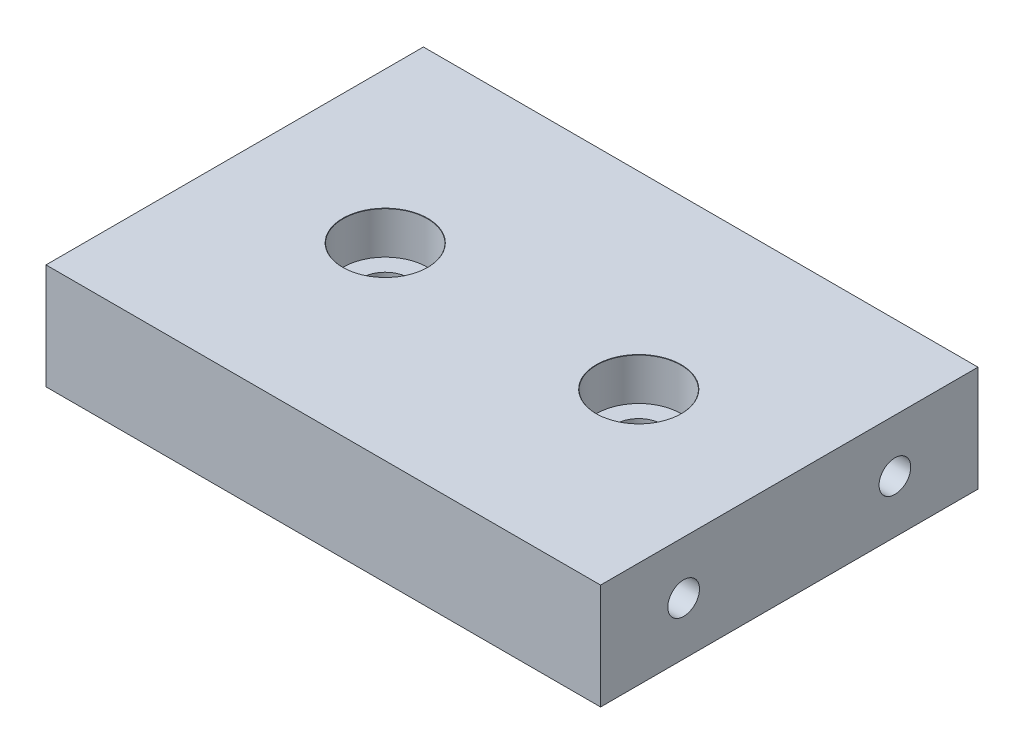
ISO-10303-21;
HEADER;
FILE_DESCRIPTION(('STEP AP214'),'2;1');
FILE_NAME('part.step','',(''),(''),'','','');
FILE_SCHEMA(('AUTOMOTIVE_DESIGN { 1 0 10303 214 1 1 1 1 }'));
ENDSEC;
DATA;
#1=APPLICATION_CONTEXT('core data for automotive mechanical design processes');
#2=APPLICATION_PROTOCOL_DEFINITION('international standard','automotive_design',2000,#1);
#3=PRODUCT_CONTEXT('',#1,'mechanical');
#4=PRODUCT('Part','Part','',(#3));
#5=PRODUCT_RELATED_PRODUCT_CATEGORY('part','',(#4));
#6=PRODUCT_DEFINITION_FORMATION('','',#4);
#7=PRODUCT_DEFINITION_CONTEXT('part definition',#1,'design');
#8=PRODUCT_DEFINITION('design','',#6,#7);
#9=PRODUCT_DEFINITION_SHAPE('','',#8);
#10=(LENGTH_UNIT() NAMED_UNIT(*) SI_UNIT(.MILLI.,.METRE.));
#11=(NAMED_UNIT(*) PLANE_ANGLE_UNIT() SI_UNIT($,.RADIAN.));
#12=(NAMED_UNIT(*) SI_UNIT($,.STERADIAN.) SOLID_ANGLE_UNIT());
#13=UNCERTAINTY_MEASURE_WITH_UNIT(LENGTH_MEASURE(1.E-05),#10,'distance_accuracy_value','');
#14=(GEOMETRIC_REPRESENTATION_CONTEXT(3) GLOBAL_UNCERTAINTY_ASSIGNED_CONTEXT((#13)) GLOBAL_UNIT_ASSIGNED_CONTEXT((#10,
#11,#12)) REPRESENTATION_CONTEXT('',''));
#15=CARTESIAN_POINT('',(0.,0.,0.));
#16=DIRECTION('',(0.,0.,1.));
#17=DIRECTION('',(1.,0.,0.));
#18=AXIS2_PLACEMENT_3D('',#15,#16,#17);
#19=CARTESIAN_POINT('',(0.,10.,0.));
#20=DIRECTION('',(1.,0.,0.));
#21=DIRECTION('',(0.,0.,-1.));
#22=AXIS2_PLACEMENT_3D('',#19,#20,#21);
#23=PLANE('',#22);
#24=CARTESIAN_POINT('',(0.,5.,-27.865));
#25=DIRECTION('',(-1.,0.,0.));
#26=DIRECTION('',(0.,0.,1.));
#27=AXIS2_PLACEMENT_3D('',#24,#25,#26);
#28=CIRCLE('',#27,1.5);
#29=CARTESIAN_POINT('',(0.,5.,-26.365));
#30=VERTEX_POINT('',#29);
#31=EDGE_CURVE('E142',#30,#30,#28,.T.);
#32=ORIENTED_EDGE('',*,*,#31,.F.);
#33=EDGE_LOOP('',(#32));
#34=FACE_BOUND('',#33,.T.);
#35=CARTESIAN_POINT('',(0.,5.,-7.865));
#36=DIRECTION('',(-1.,0.,0.));
#37=DIRECTION('',(0.,0.,1.));
#38=AXIS2_PLACEMENT_3D('',#35,#36,#37);
#39=CIRCLE('',#38,1.5);
#40=CARTESIAN_POINT('',(0.,5.,-6.365));
#41=VERTEX_POINT('',#40);
#42=EDGE_CURVE('E137',#41,#41,#39,.T.);
#43=ORIENTED_EDGE('',*,*,#42,.F.);
#44=EDGE_LOOP('',(#43));
#45=FACE_BOUND('',#44,.T.);
#46=DIRECTION('',(0.,0.,1.));
#47=VECTOR('',#46,1.);
#48=CARTESIAN_POINT('',(0.,0.,0.));
#49=LINE('',#48,#47);
#50=CARTESIAN_POINT('',(0.,0.,-35.73));
#51=VERTEX_POINT('',#50);
#52=CARTESIAN_POINT('',(0.,0.,0.));
#53=VERTEX_POINT('',#52);
#54=EDGE_CURVE('E112',#51,#53,#49,.T.);
#55=ORIENTED_EDGE('',*,*,#54,.T.);
#56=DIRECTION('',(0.,-1.,0.));
#57=VECTOR('',#56,1.);
#58=CARTESIAN_POINT('',(0.,10.,0.));
#59=LINE('',#58,#57);
#60=CARTESIAN_POINT('',(0.,10.,0.));
#61=VERTEX_POINT('',#60);
#62=EDGE_CURVE('E11',#61,#53,#59,.T.);
#63=ORIENTED_EDGE('',*,*,#62,.F.);
#64=DIRECTION('',(0.,0.,1.));
#65=VECTOR('',#64,1.);
#66=CARTESIAN_POINT('',(0.,10.,0.));
#67=LINE('',#66,#65);
#68=CARTESIAN_POINT('',(0.,10.,-35.73));
#69=VERTEX_POINT('',#68);
#70=EDGE_CURVE('E96',#69,#61,#67,.T.);
#71=ORIENTED_EDGE('',*,*,#70,.F.);
#72=DIRECTION('',(0.,-1.,0.));
#73=VECTOR('',#72,1.);
#74=CARTESIAN_POINT('',(0.,10.,-35.73));
#75=LINE('',#74,#73);
#76=EDGE_CURVE('E108',#69,#51,#75,.T.);
#77=ORIENTED_EDGE('',*,*,#76,.T.);
#78=EDGE_LOOP('',(#55,#63,#71,#77));
#79=FACE_BOUND('',#78,.T.);
#80=ADVANCED_FACE('F44',(#34,#45,#79),#23,.F.);
#81=CARTESIAN_POINT('',(0.,10.,0.));
#82=DIRECTION('',(0.,0.,-1.));
#83=DIRECTION('',(-1.,0.,0.));
#84=AXIS2_PLACEMENT_3D('',#81,#82,#83);
#85=PLANE('',#84);
#86=DIRECTION('',(1.,0.,0.));
#87=VECTOR('',#86,1.);
#88=CARTESIAN_POINT('',(0.,0.,0.));
#89=LINE('',#88,#87);
#90=CARTESIAN_POINT('',(52.5,0.,0.));
#91=VERTEX_POINT('',#90);
#92=EDGE_CURVE('E101',#53,#91,#89,.T.);
#93=ORIENTED_EDGE('',*,*,#92,.T.);
#94=DIRECTION('',(0.,-1.,0.));
#95=VECTOR('',#94,1.);
#96=CARTESIAN_POINT('',(52.5,10.,0.));
#97=LINE('',#96,#95);
#98=CARTESIAN_POINT('',(52.5,10.,0.));
#99=VERTEX_POINT('',#98);
#100=EDGE_CURVE('E53',#99,#91,#97,.T.);
#101=ORIENTED_EDGE('',*,*,#100,.F.);
#102=DIRECTION('',(1.,0.,0.));
#103=VECTOR('',#102,1.);
#104=CARTESIAN_POINT('',(0.,10.,0.));
#105=LINE('',#104,#103);
#106=EDGE_CURVE('E91',#61,#99,#105,.T.);
#107=ORIENTED_EDGE('',*,*,#106,.F.);
#108=ORIENTED_EDGE('',*,*,#62,.T.);
#109=EDGE_LOOP('',(#93,#101,#107,#108));
#110=FACE_BOUND('',#109,.T.);
#111=ADVANCED_FACE('F100',(#110),#85,.F.);
#112=CARTESIAN_POINT('',(52.5,10.,0.));
#113=DIRECTION('',(-1.,0.,0.));
#114=DIRECTION('',(0.,0.,1.));
#115=AXIS2_PLACEMENT_3D('',#112,#113,#114);
#116=PLANE('',#115);
#117=CARTESIAN_POINT('',(52.5,5.,-27.865));
#118=DIRECTION('',(-1.,0.,0.));
#119=DIRECTION('',(0.,0.,1.));
#120=AXIS2_PLACEMENT_3D('',#117,#118,#119);
#121=CIRCLE('',#120,1.5);
#122=CARTESIAN_POINT('',(52.5,5.,-26.365));
#123=VERTEX_POINT('',#122);
#124=EDGE_CURVE('E158',#123,#123,#121,.T.);
#125=ORIENTED_EDGE('',*,*,#124,.T.);
#126=EDGE_LOOP('',(#125));
#127=FACE_BOUND('',#126,.T.);
#128=CARTESIAN_POINT('',(52.5,5.,-7.865));
#129=DIRECTION('',(-1.,0.,0.));
#130=DIRECTION('',(0.,0.,1.));
#131=AXIS2_PLACEMENT_3D('',#128,#129,#130);
#132=CIRCLE('',#131,1.5);
#133=CARTESIAN_POINT('',(52.5,5.,-6.365));
#134=VERTEX_POINT('',#133);
#135=EDGE_CURVE('E149',#134,#134,#132,.T.);
#136=ORIENTED_EDGE('',*,*,#135,.T.);
#137=EDGE_LOOP('',(#136));
#138=FACE_BOUND('',#137,.T.);
#139=DIRECTION('',(0.,0.,-1.));
#140=VECTOR('',#139,1.);
#141=CARTESIAN_POINT('',(52.5,0.,0.));
#142=LINE('',#141,#140);
#143=CARTESIAN_POINT('',(52.5,0.,-35.73));
#144=VERTEX_POINT('',#143);
#145=EDGE_CURVE('E78',#91,#144,#142,.T.);
#146=ORIENTED_EDGE('',*,*,#145,.T.);
#147=DIRECTION('',(0.,-1.,0.));
#148=VECTOR('',#147,1.);
#149=CARTESIAN_POINT('',(52.5,10.,-35.73));
#150=LINE('',#149,#148);
#151=CARTESIAN_POINT('',(52.5,10.,-35.73));
#152=VERTEX_POINT('',#151);
#153=EDGE_CURVE('E103',#152,#144,#150,.T.);
#154=ORIENTED_EDGE('',*,*,#153,.F.);
#155=DIRECTION('',(0.,0.,-1.));
#156=VECTOR('',#155,1.);
#157=CARTESIAN_POINT('',(52.5,10.,0.));
#158=LINE('',#157,#156);
#159=EDGE_CURVE('E94',#99,#152,#158,.T.);
#160=ORIENTED_EDGE('',*,*,#159,.F.);
#161=ORIENTED_EDGE('',*,*,#100,.T.);
#162=EDGE_LOOP('',(#146,#154,#160,#161));
#163=FACE_BOUND('',#162,.T.);
#164=ADVANCED_FACE('F104',(#127,#138,#163),#116,.F.);
#165=CARTESIAN_POINT('',(0.,10.,-35.73));
#166=DIRECTION('',(0.,0.,1.));
#167=DIRECTION('',(1.,0.,0.));
#168=AXIS2_PLACEMENT_3D('',#165,#166,#167);
#169=PLANE('',#168);
#170=DIRECTION('',(-1.,0.,0.));
#171=VECTOR('',#170,1.);
#172=CARTESIAN_POINT('',(0.,0.,-35.73));
#173=LINE('',#172,#171);
#174=EDGE_CURVE('E84',#144,#51,#173,.T.);
#175=ORIENTED_EDGE('',*,*,#174,.T.);
#176=ORIENTED_EDGE('',*,*,#76,.F.);
#177=DIRECTION('',(-1.,0.,0.));
#178=VECTOR('',#177,1.);
#179=CARTESIAN_POINT('',(0.,10.,-35.73));
#180=LINE('',#179,#178);
#181=EDGE_CURVE('E61',#152,#69,#180,.T.);
#182=ORIENTED_EDGE('',*,*,#181,.F.);
#183=ORIENTED_EDGE('',*,*,#153,.T.);
#184=EDGE_LOOP('',(#175,#176,#182,#183));
#185=FACE_BOUND('',#184,.T.);
#186=ADVANCED_FACE('F126',(#185),#169,.F.);
#187=CARTESIAN_POINT('',(0.,10.,0.));
#188=DIRECTION('',(0.,-1.,0.));
#189=DIRECTION('',(0.,0.,-1.));
#190=AXIS2_PLACEMENT_3D('',#187,#188,#189);
#191=PLANE('',#190);
#192=CARTESIAN_POINT('',(14.25,10.,-17.865));
#193=DIRECTION('',(0.,1.,0.));
#194=DIRECTION('',(0.,0.,1.));
#195=AXIS2_PLACEMENT_3D('',#192,#193,#194);
#196=CIRCLE('',#195,4.025);
#197=CARTESIAN_POINT('',(14.25,10.,-13.84));
#198=VERTEX_POINT('',#197);
#199=EDGE_CURVE('E200',#198,#198,#196,.T.);
#200=ORIENTED_EDGE('',*,*,#199,.F.);
#201=EDGE_LOOP('',(#200));
#202=FACE_BOUND('',#201,.T.);
#203=CARTESIAN_POINT('',(38.25,10.,-17.865));
#204=DIRECTION('',(0.,1.,0.));
#205=DIRECTION('',(0.,0.,1.));
#206=AXIS2_PLACEMENT_3D('',#203,#204,#205);
#207=CIRCLE('',#206,4.025);
#208=CARTESIAN_POINT('',(38.25,10.,-13.84));
#209=VERTEX_POINT('',#208);
#210=EDGE_CURVE('E180',#209,#209,#207,.T.);
#211=ORIENTED_EDGE('',*,*,#210,.F.);
#212=EDGE_LOOP('',(#211));
#213=FACE_BOUND('',#212,.T.);
#214=ORIENTED_EDGE('',*,*,#70,.T.);
#215=ORIENTED_EDGE('',*,*,#106,.T.);
#216=ORIENTED_EDGE('',*,*,#159,.T.);
#217=ORIENTED_EDGE('',*,*,#181,.T.);
#218=EDGE_LOOP('',(#214,#215,#216,#217));
#219=FACE_BOUND('',#218,.T.);
#220=ADVANCED_FACE('F92',(#202,#213,#219),#191,.F.);
#221=CARTESIAN_POINT('',(0.,0.,0.));
#222=DIRECTION('',(0.,-1.,0.));
#223=DIRECTION('',(0.,0.,-1.));
#224=AXIS2_PLACEMENT_3D('',#221,#222,#223);
#225=PLANE('',#224);
#226=CARTESIAN_POINT('',(14.25,0.,-17.865));
#227=DIRECTION('',(0.,1.,0.));
#228=DIRECTION('',(0.,0.,1.));
#229=AXIS2_PLACEMENT_3D('',#226,#227,#228);
#230=CIRCLE('',#229,2.25);
#231=CARTESIAN_POINT('',(14.25,0.,-15.615));
#232=VERTEX_POINT('',#231);
#233=EDGE_CURVE('E184',#232,#232,#230,.T.);
#234=ORIENTED_EDGE('',*,*,#233,.T.);
#235=EDGE_LOOP('',(#234));
#236=FACE_BOUND('',#235,.T.);
#237=CARTESIAN_POINT('',(38.25,0.,-17.865));
#238=DIRECTION('',(0.,1.,0.));
#239=DIRECTION('',(0.,0.,1.));
#240=AXIS2_PLACEMENT_3D('',#237,#238,#239);
#241=CIRCLE('',#240,2.25);
#242=CARTESIAN_POINT('',(38.25,0.,-15.615));
#243=VERTEX_POINT('',#242);
#244=EDGE_CURVE('E154',#243,#243,#241,.T.);
#245=ORIENTED_EDGE('',*,*,#244,.T.);
#246=EDGE_LOOP('',(#245));
#247=FACE_BOUND('',#246,.T.);
#248=ORIENTED_EDGE('',*,*,#54,.F.);
#249=ORIENTED_EDGE('',*,*,#174,.F.);
#250=ORIENTED_EDGE('',*,*,#145,.F.);
#251=ORIENTED_EDGE('',*,*,#92,.F.);
#252=EDGE_LOOP('',(#248,#249,#250,#251));
#253=FACE_BOUND('',#252,.T.);
#254=ADVANCED_FACE('F129',(#236,#247,#253),#225,.T.);
#255=CARTESIAN_POINT('',(10.,5.,-7.865));
#256=DIRECTION('',(-1.,0.,0.));
#257=DIRECTION('',(0.,0.,1.));
#258=AXIS2_PLACEMENT_3D('',#255,#256,#257);
#259=CYLINDRICAL_SURFACE('',#258,1.5);
#260=CARTESIAN_POINT('',(10.,5.,-7.865));
#261=DIRECTION('',(-1.,0.,0.));
#262=DIRECTION('',(0.,0.,1.));
#263=AXIS2_PLACEMENT_3D('',#260,#261,#262);
#264=CIRCLE('',#263,1.5);
#265=CARTESIAN_POINT('',(10.,5.,-6.365));
#266=VERTEX_POINT('',#265);
#267=EDGE_CURVE('E133',#266,#266,#264,.T.);
#268=ORIENTED_EDGE('',*,*,#267,.F.);
#269=EDGE_LOOP('',(#268));
#270=FACE_BOUND('',#269,.T.);
#271=ORIENTED_EDGE('',*,*,#42,.T.);
#272=EDGE_LOOP('',(#271));
#273=FACE_BOUND('',#272,.T.);
#274=ADVANCED_FACE('F240',(#270,#273),#259,.F.);
#275=CARTESIAN_POINT('',(10.,5.,-7.865));
#276=DIRECTION('',(-1.,0.,0.));
#277=DIRECTION('',(0.,0.,1.));
#278=AXIS2_PLACEMENT_3D('',#275,#276,#277);
#279=PLANE('',#278);
#280=ORIENTED_EDGE('',*,*,#267,.T.);
#281=EDGE_LOOP('',(#280));
#282=FACE_BOUND('',#281,.T.);
#283=ADVANCED_FACE('F241',(#282),#279,.T.);
#284=CARTESIAN_POINT('',(10.,5.,-27.865));
#285=DIRECTION('',(-1.,0.,0.));
#286=DIRECTION('',(0.,0.,1.));
#287=AXIS2_PLACEMENT_3D('',#284,#285,#286);
#288=CYLINDRICAL_SURFACE('',#287,1.5);
#289=CARTESIAN_POINT('',(10.,5.,-27.865));
#290=DIRECTION('',(-1.,0.,0.));
#291=DIRECTION('',(0.,0.,1.));
#292=AXIS2_PLACEMENT_3D('',#289,#290,#291);
#293=CIRCLE('',#292,1.5);
#294=CARTESIAN_POINT('',(10.,5.,-26.365));
#295=VERTEX_POINT('',#294);
#296=EDGE_CURVE('E116',#295,#295,#293,.T.);
#297=ORIENTED_EDGE('',*,*,#296,.F.);
#298=EDGE_LOOP('',(#297));
#299=FACE_BOUND('',#298,.T.);
#300=ORIENTED_EDGE('',*,*,#31,.T.);
#301=EDGE_LOOP('',(#300));
#302=FACE_BOUND('',#301,.T.);
#303=ADVANCED_FACE('F247',(#299,#302),#288,.F.);
#304=CARTESIAN_POINT('',(10.,5.,-27.865));
#305=DIRECTION('',(-1.,0.,0.));
#306=DIRECTION('',(0.,0.,1.));
#307=AXIS2_PLACEMENT_3D('',#304,#305,#306);
#308=PLANE('',#307);
#309=ORIENTED_EDGE('',*,*,#296,.T.);
#310=EDGE_LOOP('',(#309));
#311=FACE_BOUND('',#310,.T.);
#312=ADVANCED_FACE('F270',(#311),#308,.T.);
#313=CARTESIAN_POINT('',(42.5,5.,-7.865));
#314=DIRECTION('',(1.,0.,0.));
#315=DIRECTION('',(0.,0.,-1.));
#316=AXIS2_PLACEMENT_3D('',#313,#314,#315);
#317=CYLINDRICAL_SURFACE('',#316,1.5);
#318=CARTESIAN_POINT('',(42.5,5.,-7.865));
#319=DIRECTION('',(-1.,0.,0.));
#320=DIRECTION('',(0.,0.,1.));
#321=AXIS2_PLACEMENT_3D('',#318,#319,#320);
#322=CIRCLE('',#321,1.5);
#323=CARTESIAN_POINT('',(42.5,5.,-6.365));
#324=VERTEX_POINT('',#323);
#325=EDGE_CURVE('E153',#324,#324,#322,.T.);
#326=ORIENTED_EDGE('',*,*,#325,.T.);
#327=EDGE_LOOP('',(#326));
#328=FACE_BOUND('',#327,.T.);
#329=ORIENTED_EDGE('',*,*,#135,.F.);
#330=EDGE_LOOP('',(#329));
#331=FACE_BOUND('',#330,.T.);
#332=ADVANCED_FACE('F268',(#328,#331),#317,.F.);
#333=CARTESIAN_POINT('',(42.5,5.,-7.865));
#334=DIRECTION('',(1.,0.,0.));
#335=DIRECTION('',(0.,0.,1.));
#336=AXIS2_PLACEMENT_3D('',#333,#334,#335);
#337=PLANE('',#336);
#338=ORIENTED_EDGE('',*,*,#325,.F.);
#339=EDGE_LOOP('',(#338));
#340=FACE_BOUND('',#339,.T.);
#341=ADVANCED_FACE('F269',(#340),#337,.T.);
#342=CARTESIAN_POINT('',(42.5,5.,-27.865));
#343=DIRECTION('',(1.,0.,0.));
#344=DIRECTION('',(0.,0.,-1.));
#345=AXIS2_PLACEMENT_3D('',#342,#343,#344);
#346=CYLINDRICAL_SURFACE('',#345,1.5);
#347=CARTESIAN_POINT('',(42.5,5.,-27.865));
#348=DIRECTION('',(-1.,0.,0.));
#349=DIRECTION('',(0.,0.,1.));
#350=AXIS2_PLACEMENT_3D('',#347,#348,#349);
#351=CIRCLE('',#350,1.5);
#352=CARTESIAN_POINT('',(42.5,5.,-26.365));
#353=VERTEX_POINT('',#352);
#354=EDGE_CURVE('E138',#353,#353,#351,.T.);
#355=ORIENTED_EDGE('',*,*,#354,.T.);
#356=EDGE_LOOP('',(#355));
#357=FACE_BOUND('',#356,.T.);
#358=ORIENTED_EDGE('',*,*,#124,.F.);
#359=EDGE_LOOP('',(#358));
#360=FACE_BOUND('',#359,.T.);
#361=ADVANCED_FACE('F276',(#357,#360),#346,.F.);
#362=CARTESIAN_POINT('',(42.5,5.,-27.865));
#363=DIRECTION('',(1.,0.,0.));
#364=DIRECTION('',(0.,0.,1.));
#365=AXIS2_PLACEMENT_3D('',#362,#363,#364);
#366=PLANE('',#365);
#367=ORIENTED_EDGE('',*,*,#354,.F.);
#368=EDGE_LOOP('',(#367));
#369=FACE_BOUND('',#368,.T.);
#370=ADVANCED_FACE('F283',(#369),#366,.T.);
#371=CARTESIAN_POINT('',(38.25,10.,-17.865));
#372=DIRECTION('',(0.,1.,0.));
#373=DIRECTION('',(0.,0.,1.));
#374=AXIS2_PLACEMENT_3D('',#371,#372,#373);
#375=CYLINDRICAL_SURFACE('',#374,2.25);
#376=ORIENTED_EDGE('',*,*,#244,.F.);
#377=EDGE_LOOP('',(#376));
#378=FACE_BOUND('',#377,.T.);
#379=CARTESIAN_POINT('',(38.25,6.,-17.865));
#380=DIRECTION('',(0.,1.,0.));
#381=DIRECTION('',(0.,0.,1.));
#382=AXIS2_PLACEMENT_3D('',#379,#380,#381);
#383=CIRCLE('',#382,2.25);
#384=CARTESIAN_POINT('',(38.25,6.,-15.615));
#385=VERTEX_POINT('',#384);
#386=EDGE_CURVE('E168',#385,#385,#383,.T.);
#387=ORIENTED_EDGE('',*,*,#386,.T.);
#388=EDGE_LOOP('',(#387));
#389=FACE_BOUND('',#388,.T.);
#390=ADVANCED_FACE('F287',(#378,#389),#375,.F.);
#391=CARTESIAN_POINT('',(42.25,6.,-17.865));
#392=DIRECTION('',(0.,-1.,0.));
#393=DIRECTION('',(0.,0.,-1.));
#394=AXIS2_PLACEMENT_3D('',#391,#392,#393);
#395=PLANE('',#394);
#396=ORIENTED_EDGE('',*,*,#386,.F.);
#397=EDGE_LOOP('',(#396));
#398=FACE_BOUND('',#397,.T.);
#399=CARTESIAN_POINT('',(38.25,6.,-17.865));
#400=DIRECTION('',(0.,1.,0.));
#401=DIRECTION('',(0.,0.,1.));
#402=AXIS2_PLACEMENT_3D('',#399,#400,#401);
#403=CIRCLE('',#402,4.);
#404=CARTESIAN_POINT('',(38.25,6.,-13.865));
#405=VERTEX_POINT('',#404);
#406=EDGE_CURVE('E172',#405,#405,#403,.T.);
#407=ORIENTED_EDGE('',*,*,#406,.T.);
#408=EDGE_LOOP('',(#407));
#409=FACE_BOUND('',#408,.T.);
#410=ADVANCED_FACE('F225',(#398,#409),#395,.F.);
#411=CARTESIAN_POINT('',(38.25,10.,-17.865));
#412=DIRECTION('',(0.,1.,0.));
#413=DIRECTION('',(0.,0.,1.));
#414=AXIS2_PLACEMENT_3D('',#411,#412,#413);
#415=CYLINDRICAL_SURFACE('',#414,4.);
#416=ORIENTED_EDGE('',*,*,#406,.F.);
#417=EDGE_LOOP('',(#416));
#418=FACE_BOUND('',#417,.T.);
#419=CARTESIAN_POINT('',(38.25,9.975,-17.865));
#420=DIRECTION('',(0.,1.,0.));
#421=DIRECTION('',(0.,0.,1.));
#422=AXIS2_PLACEMENT_3D('',#419,#420,#421);
#423=CIRCLE('',#422,4.);
#424=CARTESIAN_POINT('',(38.25,9.975,-13.865));
#425=VERTEX_POINT('',#424);
#426=EDGE_CURVE('E176',#425,#425,#423,.T.);
#427=ORIENTED_EDGE('',*,*,#426,.T.);
#428=EDGE_LOOP('',(#427));
#429=FACE_BOUND('',#428,.T.);
#430=ADVANCED_FACE('F215',(#418,#429),#415,.F.);
#431=CARTESIAN_POINT('',(38.25,10.,-17.865));
#432=DIRECTION('',(0.,1.,0.));
#433=DIRECTION('',(0.,0.,1.));
#434=AXIS2_PLACEMENT_3D('',#431,#432,#433);
#435=CONICAL_SURFACE('',#434,4.025,0.785398163397483);
#436=ORIENTED_EDGE('',*,*,#426,.F.);
#437=EDGE_LOOP('',(#436));
#438=FACE_BOUND('',#437,.T.);
#439=ORIENTED_EDGE('',*,*,#210,.T.);
#440=EDGE_LOOP('',(#439));
#441=FACE_BOUND('',#440,.T.);
#442=ADVANCED_FACE('F212',(#438,#441),#435,.F.);
#443=CARTESIAN_POINT('',(14.25,10.,-17.865));
#444=DIRECTION('',(0.,1.,0.));
#445=DIRECTION('',(0.,0.,1.));
#446=AXIS2_PLACEMENT_3D('',#443,#444,#445);
#447=CYLINDRICAL_SURFACE('',#446,2.25);
#448=ORIENTED_EDGE('',*,*,#233,.F.);
#449=EDGE_LOOP('',(#448));
#450=FACE_BOUND('',#449,.T.);
#451=CARTESIAN_POINT('',(14.25,6.,-17.865));
#452=DIRECTION('',(0.,1.,0.));
#453=DIRECTION('',(0.,0.,1.));
#454=AXIS2_PLACEMENT_3D('',#451,#452,#453);
#455=CIRCLE('',#454,2.25);
#456=CARTESIAN_POINT('',(14.25,6.,-15.615));
#457=VERTEX_POINT('',#456);
#458=EDGE_CURVE('E188',#457,#457,#455,.T.);
#459=ORIENTED_EDGE('',*,*,#458,.T.);
#460=EDGE_LOOP('',(#459));
#461=FACE_BOUND('',#460,.T.);
#462=ADVANCED_FACE('F214',(#450,#461),#447,.F.);
#463=CARTESIAN_POINT('',(18.25,6.,-17.865));
#464=DIRECTION('',(0.,-1.,0.));
#465=DIRECTION('',(0.,0.,-1.));
#466=AXIS2_PLACEMENT_3D('',#463,#464,#465);
#467=PLANE('',#466);
#468=ORIENTED_EDGE('',*,*,#458,.F.);
#469=EDGE_LOOP('',(#468));
#470=FACE_BOUND('',#469,.T.);
#471=CARTESIAN_POINT('',(14.25,6.,-17.865));
#472=DIRECTION('',(0.,1.,0.));
#473=DIRECTION('',(0.,0.,1.));
#474=AXIS2_PLACEMENT_3D('',#471,#472,#473);
#475=CIRCLE('',#474,4.);
#476=CARTESIAN_POINT('',(14.25,6.,-13.865));
#477=VERTEX_POINT('',#476);
#478=EDGE_CURVE('E192',#477,#477,#475,.T.);
#479=ORIENTED_EDGE('',*,*,#478,.T.);
#480=EDGE_LOOP('',(#479));
#481=FACE_BOUND('',#480,.T.);
#482=ADVANCED_FACE('F222',(#470,#481),#467,.F.);
#483=CARTESIAN_POINT('',(14.25,10.,-17.865));
#484=DIRECTION('',(0.,1.,0.));
#485=DIRECTION('',(0.,0.,1.));
#486=AXIS2_PLACEMENT_3D('',#483,#484,#485);
#487=CYLINDRICAL_SURFACE('',#486,4.);
#488=ORIENTED_EDGE('',*,*,#478,.F.);
#489=EDGE_LOOP('',(#488));
#490=FACE_BOUND('',#489,.T.);
#491=CARTESIAN_POINT('',(14.25,9.975,-17.865));
#492=DIRECTION('',(0.,1.,0.));
#493=DIRECTION('',(0.,0.,1.));
#494=AXIS2_PLACEMENT_3D('',#491,#492,#493);
#495=CIRCLE('',#494,4.);
#496=CARTESIAN_POINT('',(14.25,9.975,-13.865));
#497=VERTEX_POINT('',#496);
#498=EDGE_CURVE('E196',#497,#497,#495,.T.);
#499=ORIENTED_EDGE('',*,*,#498,.T.);
#500=EDGE_LOOP('',(#499));
#501=FACE_BOUND('',#500,.T.);
#502=ADVANCED_FACE('F328',(#490,#501),#487,.F.);
#503=CARTESIAN_POINT('',(14.25,10.,-17.865));
#504=DIRECTION('',(0.,1.,0.));
#505=DIRECTION('',(0.,0.,1.));
#506=AXIS2_PLACEMENT_3D('',#503,#504,#505);
#507=CONICAL_SURFACE('',#506,4.025,0.785398163397483);
#508=ORIENTED_EDGE('',*,*,#498,.F.);
#509=EDGE_LOOP('',(#508));
#510=FACE_BOUND('',#509,.T.);
#511=ORIENTED_EDGE('',*,*,#199,.T.);
#512=EDGE_LOOP('',(#511));
#513=FACE_BOUND('',#512,.T.);
#514=ADVANCED_FACE('F205',(#510,#513),#507,.F.);
#515=CLOSED_SHELL('',(#80,#111,#164,#186,#220,#254,#274,#283,#303,#312,#332,#341,#361,#370,#390,
#410,#430,#442,#462,#482,#502,#514));
#516=MANIFOLD_SOLID_BREP('B2',#515);
#517=ADVANCED_BREP_SHAPE_REPRESENTATION('',(#18,#516),#14);
#518=SHAPE_DEFINITION_REPRESENTATION(#9,#517);
ENDSEC;
END-ISO-10303-21;
